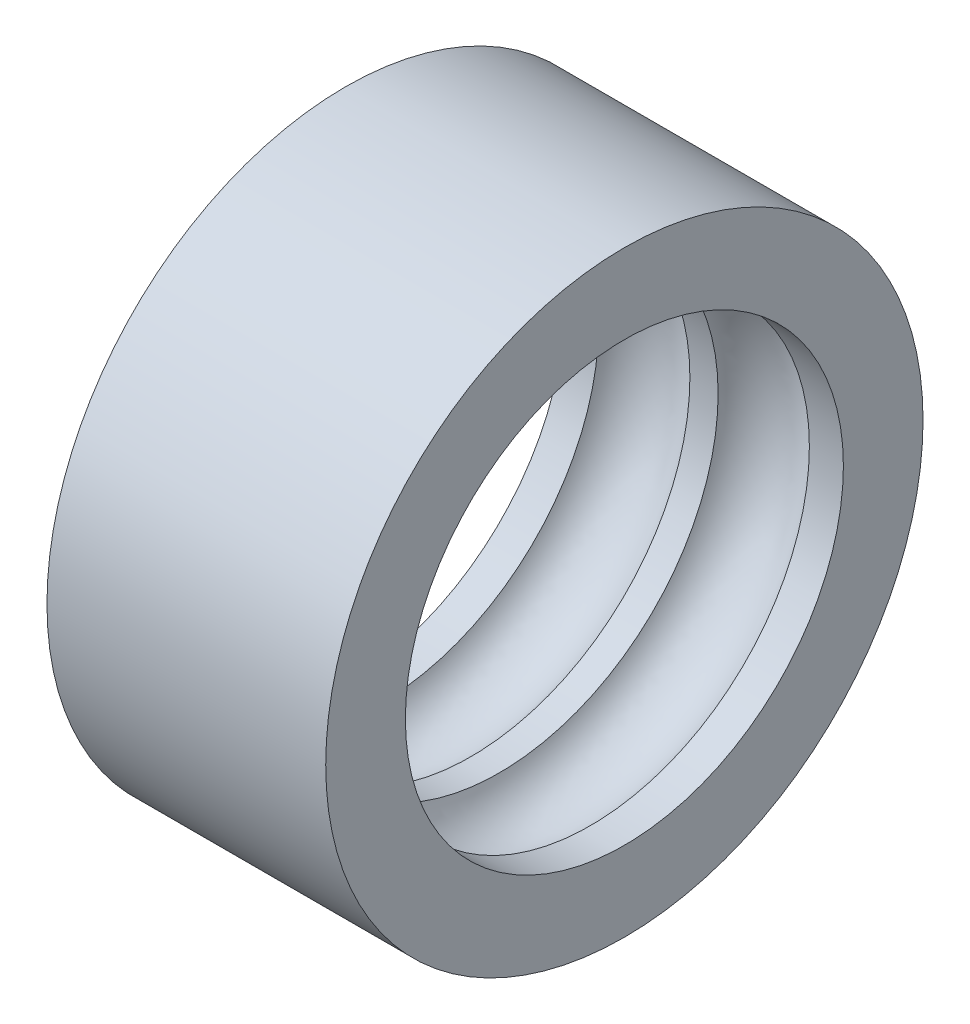
ISO-10303-21;
HEADER;
FILE_DESCRIPTION(('STEP AP214'),'2;1');
FILE_NAME('part.step','',(''),(''),'','','');
FILE_SCHEMA(('AUTOMOTIVE_DESIGN { 1 0 10303 214 1 1 1 1 }'));
ENDSEC;
DATA;
#1=APPLICATION_CONTEXT('core data for automotive mechanical design processes');
#2=APPLICATION_PROTOCOL_DEFINITION('international standard','automotive_design',2000,#1);
#3=PRODUCT_CONTEXT('',#1,'mechanical');
#4=PRODUCT('Part','Part','',(#3));
#5=PRODUCT_RELATED_PRODUCT_CATEGORY('part','',(#4));
#6=PRODUCT_DEFINITION_FORMATION('','',#4);
#7=PRODUCT_DEFINITION_CONTEXT('part definition',#1,'design');
#8=PRODUCT_DEFINITION('design','',#6,#7);
#9=PRODUCT_DEFINITION_SHAPE('','',#8);
#10=(LENGTH_UNIT() NAMED_UNIT(*) SI_UNIT(.MILLI.,.METRE.));
#11=(NAMED_UNIT(*) PLANE_ANGLE_UNIT() SI_UNIT($,.RADIAN.));
#12=(NAMED_UNIT(*) SI_UNIT($,.STERADIAN.) SOLID_ANGLE_UNIT());
#13=UNCERTAINTY_MEASURE_WITH_UNIT(LENGTH_MEASURE(1.E-05),#10,'distance_accuracy_value','');
#14=(GEOMETRIC_REPRESENTATION_CONTEXT(3) GLOBAL_UNCERTAINTY_ASSIGNED_CONTEXT((#13)) GLOBAL_UNIT_ASSIGNED_CONTEXT((#10,
#11,#12)) REPRESENTATION_CONTEXT('',''));
#15=CARTESIAN_POINT('',(0.,0.,0.));
#16=DIRECTION('',(0.,0.,1.));
#17=DIRECTION('',(1.,0.,0.));
#18=AXIS2_PLACEMENT_3D('',#15,#16,#17);
#19=CARTESIAN_POINT('',(7.7087121525221,7.2811529493745,5.2900672706323));
#20=CARTESIAN_POINT('',(6.7087121525221,9.134843756989,6.6368524761367));
#21=CARTESIAN_POINT('',(9.,9.9438607513639,7.2246377284292));
#22=CARTESIAN_POINT('',(11.291287847478,10.752877745739,7.8124229807217));
#23=CARTESIAN_POINT('',(12.291287847478,8.8991869381244,6.4656377752172));
#24=(BOUNDED_CURVE() B_SPLINE_CURVE(2,(#19,#20,#21,#22,#23),.UNSPECIFIED.,.F.,
.F.) B_SPLINE_CURVE_WITH_KNOTS((3,2,3),(0.5,0.75,1.),
.UNSPECIFIED.) CURVE() GEOMETRIC_REPRESENTATION_ITEM() RATIONAL_B_SPLINE_CURVE((1.,
0.70710678118655,1.,0.70710678118655,1.)) REPRESENTATION_ITEM(''));
#25=CARTESIAN_POINT('',(12.5,0.,0.));
#26=DIRECTION('',(-1.,0.,0.));
#27=AXIS1_PLACEMENT('',#25,#26);
#28=SURFACE_OF_REVOLUTION('',#24,#27);
#29=CARTESIAN_POINT('',(7.70871215252208,0.,0.));
#30=DIRECTION('',(-1.,0.,0.));
#31=DIRECTION('',(0.,0.,1.));
#32=AXIS2_PLACEMENT_3D('',#29,#30,#31);
#33=CIRCLE('',#32,11.);
#34=CARTESIAN_POINT('',(7.70871215252208,0.,11.));
#35=VERTEX_POINT('',#34);
#36=EDGE_CURVE('E57',#35,#35,#33,.F.);
#37=ORIENTED_EDGE('',*,*,#36,.F.);
#38=EDGE_LOOP('',(#37));
#39=FACE_BOUND('',#38,.T.);
#40=CARTESIAN_POINT('',(12.2912878474779,0.,0.));
#41=DIRECTION('',(-1.,0.,0.));
#42=DIRECTION('',(0.,0.,1.));
#43=AXIS2_PLACEMENT_3D('',#40,#41,#42);
#44=CIRCLE('',#43,11.);
#45=CARTESIAN_POINT('',(12.2912878474779,0.,11.));
#46=VERTEX_POINT('',#45);
#47=EDGE_CURVE('E62',#46,#46,#44,.T.);
#48=ORIENTED_EDGE('',*,*,#47,.F.);
#49=EDGE_LOOP('',(#48));
#50=FACE_BOUND('',#49,.T.);
#51=ADVANCED_FACE('F15',(#39,#50),#28,.T.);
#52=CARTESIAN_POINT('',(14.,0.,0.));
#53=DIRECTION('',(-1.,0.,0.));
#54=DIRECTION('',(0.,0.,1.));
#55=AXIS2_PLACEMENT_3D('',#52,#53,#54);
#56=CYLINDRICAL_SURFACE('',#55,11.);
#57=CARTESIAN_POINT('',(14.,0.,0.));
#58=DIRECTION('',(-1.,0.,0.));
#59=DIRECTION('',(0.,0.,1.));
#60=AXIS2_PLACEMENT_3D('',#57,#58,#59);
#61=CIRCLE('',#60,11.);
#62=CARTESIAN_POINT('',(14.,0.,11.));
#63=VERTEX_POINT('',#62);
#64=EDGE_CURVE('E52',#63,#63,#61,.T.);
#65=ORIENTED_EDGE('',*,*,#64,.F.);
#66=EDGE_LOOP('',(#65));
#67=FACE_BOUND('',#66,.T.);
#68=ORIENTED_EDGE('',*,*,#47,.T.);
#69=EDGE_LOOP('',(#68));
#70=FACE_BOUND('',#69,.T.);
#71=ADVANCED_FACE('F67',(#67,#70),#56,.F.);
#72=CARTESIAN_POINT('',(7.70871215252208,0.,0.));
#73=DIRECTION('',(-1.,0.,0.));
#74=DIRECTION('',(0.,0.,1.));
#75=AXIS2_PLACEMENT_3D('',#72,#73,#74);
#76=CYLINDRICAL_SURFACE('',#75,11.);
#77=ORIENTED_EDGE('',*,*,#36,.T.);
#78=EDGE_LOOP('',(#77));
#79=FACE_BOUND('',#78,.T.);
#80=CARTESIAN_POINT('',(6.29128784747792,0.,0.));
#81=DIRECTION('',(-1.,0.,0.));
#82=DIRECTION('',(0.,0.,1.));
#83=AXIS2_PLACEMENT_3D('',#80,#81,#82);
#84=CIRCLE('',#83,11.);
#85=CARTESIAN_POINT('',(6.29128784747792,0.,11.));
#86=VERTEX_POINT('',#85);
#87=EDGE_CURVE('E47',#86,#86,#84,.T.);
#88=ORIENTED_EDGE('',*,*,#87,.T.);
#89=EDGE_LOOP('',(#88));
#90=FACE_BOUND('',#89,.T.);
#91=ADVANCED_FACE('F77',(#79,#90),#76,.F.);
#92=CARTESIAN_POINT('',(14.,-3.3184761312371,-20.952033700011));
#93=DIRECTION('',(1.,0.,0.));
#94=DIRECTION('',(0.,0.809016994374948,0.587785252292472));
#95=AXIS2_PLACEMENT_3D('',#92,#93,#94);
#96=PLANE('',#95);
#97=ORIENTED_EDGE('',*,*,#64,.T.);
#98=EDGE_LOOP('',(#97));
#99=FACE_BOUND('',#98,.T.);
#100=CARTESIAN_POINT('',(14.,0.,0.));
#101=DIRECTION('',(-1.,0.,0.));
#102=DIRECTION('',(0.,0.,1.));
#103=AXIS2_PLACEMENT_3D('',#100,#101,#102);
#104=CIRCLE('',#103,14.9999999999998);
#105=CARTESIAN_POINT('',(14.,0.,14.9999999999998));
#106=VERTEX_POINT('',#105);
#107=EDGE_CURVE('E42',#106,#106,#104,.F.);
#108=ORIENTED_EDGE('',*,*,#107,.T.);
#109=EDGE_LOOP('',(#108));
#110=FACE_BOUND('',#109,.T.);
#111=ADVANCED_FACE('F100',(#99,#110),#96,.T.);
#112=CARTESIAN_POINT('',(1.7087121525221,7.2811529493745,5.2900672706323));
#113=CARTESIAN_POINT('',(0.70871215252208,9.134843756989,6.6368524761367));
#114=CARTESIAN_POINT('',(3.,9.9438607513639,7.2246377284292));
#115=CARTESIAN_POINT('',(5.2912878474779,10.752877745739,7.8124229807217));
#116=CARTESIAN_POINT('',(6.2912878474779,8.8991869381244,6.4656377752172));
#117=(BOUNDED_CURVE() B_SPLINE_CURVE(2,(#112,#113,#114,#115,#116),.UNSPECIFIED.,.F.,
.F.) B_SPLINE_CURVE_WITH_KNOTS((3,2,3),(0.5,0.75,1.),
.UNSPECIFIED.) CURVE() GEOMETRIC_REPRESENTATION_ITEM() RATIONAL_B_SPLINE_CURVE((1.,
0.70710678118655,1.,0.70710678118655,1.)) REPRESENTATION_ITEM(''));
#118=CARTESIAN_POINT('',(6.5,0.,0.));
#119=DIRECTION('',(-1.,0.,0.));
#120=AXIS1_PLACEMENT('',#118,#119);
#121=SURFACE_OF_REVOLUTION('',#117,#120);
#122=CARTESIAN_POINT('',(1.70871215252206,0.,0.));
#123=DIRECTION('',(-1.,0.,0.));
#124=DIRECTION('',(0.,0.,1.));
#125=AXIS2_PLACEMENT_3D('',#122,#123,#124);
#126=CIRCLE('',#125,11.);
#127=CARTESIAN_POINT('',(1.70871215252206,0.,11.));
#128=VERTEX_POINT('',#127);
#129=EDGE_CURVE('E28',#128,#128,#126,.F.);
#130=ORIENTED_EDGE('',*,*,#129,.F.);
#131=EDGE_LOOP('',(#130));
#132=FACE_BOUND('',#131,.T.);
#133=ORIENTED_EDGE('',*,*,#87,.F.);
#134=EDGE_LOOP('',(#133));
#135=FACE_BOUND('',#134,.T.);
#136=ADVANCED_FACE('F94',(#132,#135),#121,.T.);
#137=CARTESIAN_POINT('',(14.,0.,0.));
#138=DIRECTION('',(-1.,0.,0.));
#139=DIRECTION('',(0.,0.,1.));
#140=AXIS2_PLACEMENT_3D('',#137,#138,#139);
#141=CYLINDRICAL_SURFACE('',#140,14.9999999999998);
#142=ORIENTED_EDGE('',*,*,#107,.F.);
#143=EDGE_LOOP('',(#142));
#144=FACE_BOUND('',#143,.T.);
#145=CARTESIAN_POINT('',(0.,0.,0.));
#146=DIRECTION('',(-1.,0.,0.));
#147=DIRECTION('',(0.,0.,1.));
#148=AXIS2_PLACEMENT_3D('',#145,#146,#147);
#149=CIRCLE('',#148,14.9999999999998);
#150=CARTESIAN_POINT('',(0.,0.,14.9999999999998));
#151=VERTEX_POINT('',#150);
#152=EDGE_CURVE('E23',#151,#151,#149,.T.);
#153=ORIENTED_EDGE('',*,*,#152,.F.);
#154=EDGE_LOOP('',(#153));
#155=FACE_BOUND('',#154,.T.);
#156=ADVANCED_FACE('F87',(#144,#155),#141,.T.);
#157=CARTESIAN_POINT('',(1.70871215252206,0.,0.));
#158=DIRECTION('',(-1.,0.,0.));
#159=DIRECTION('',(0.,0.,1.));
#160=AXIS2_PLACEMENT_3D('',#157,#158,#159);
#161=CYLINDRICAL_SURFACE('',#160,11.);
#162=ORIENTED_EDGE('',*,*,#129,.T.);
#163=EDGE_LOOP('',(#162));
#164=FACE_BOUND('',#163,.T.);
#165=CARTESIAN_POINT('',(0.,0.,0.));
#166=DIRECTION('',(-1.,0.,0.));
#167=DIRECTION('',(0.,0.,1.));
#168=AXIS2_PLACEMENT_3D('',#165,#166,#167);
#169=CIRCLE('',#168,11.);
#170=CARTESIAN_POINT('',(0.,0.,11.));
#171=VERTEX_POINT('',#170);
#172=EDGE_CURVE('E10',#171,#171,#169,.F.);
#173=ORIENTED_EDGE('',*,*,#172,.F.);
#174=EDGE_LOOP('',(#173));
#175=FACE_BOUND('',#174,.T.);
#176=ADVANCED_FACE('F82',(#164,#175),#161,.F.);
#177=CARTESIAN_POINT('',(0.,-20.952033700011,3.3184761312371));
#178=DIRECTION('',(-1.,0.,0.));
#179=DIRECTION('',(0.,0.809016994374948,0.587785252292472));
#180=AXIS2_PLACEMENT_3D('',#177,#178,#179);
#181=PLANE('',#180);
#182=ORIENTED_EDGE('',*,*,#172,.T.);
#183=EDGE_LOOP('',(#182));
#184=FACE_BOUND('',#183,.T.);
#185=ORIENTED_EDGE('',*,*,#152,.T.);
#186=EDGE_LOOP('',(#185));
#187=FACE_BOUND('',#186,.T.);
#188=ADVANCED_FACE('F17',(#184,#187),#181,.T.);
#189=CLOSED_SHELL('',(#51,#71,#91,#111,#136,#156,#176,#188));
#190=MANIFOLD_SOLID_BREP('B1',#189);
#191=ADVANCED_BREP_SHAPE_REPRESENTATION('',(#18,#190),#14);
#192=SHAPE_DEFINITION_REPRESENTATION(#9,#191);
ENDSEC;
END-ISO-10303-21;
